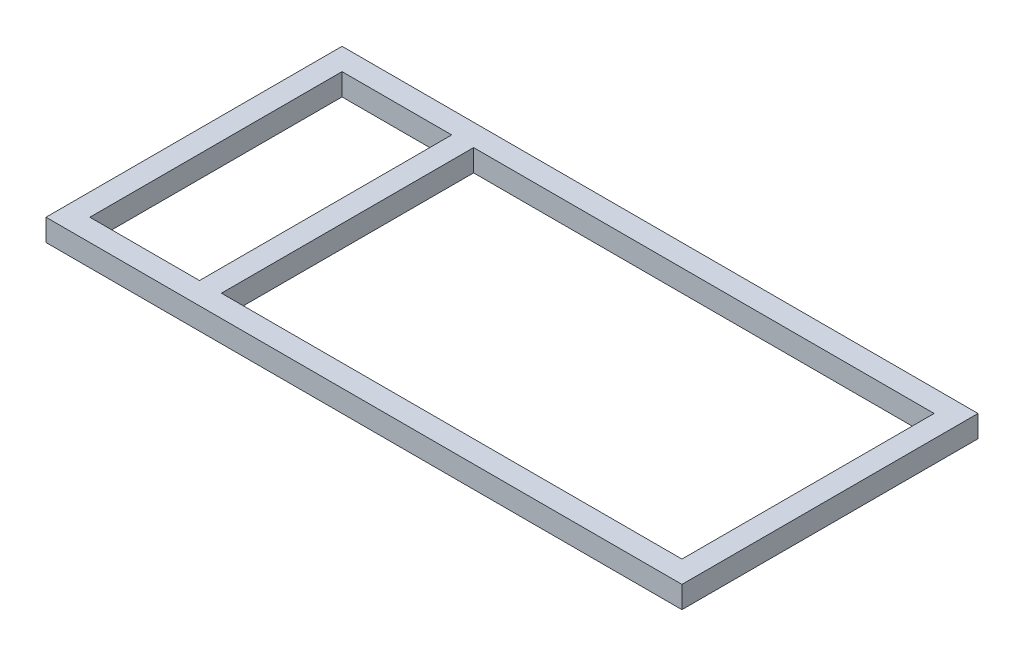
ISO-10303-21;
HEADER;
FILE_DESCRIPTION(('STEP AP214'),'2;1');
FILE_NAME('part.step','',(''),(''),'','','');
FILE_SCHEMA(('AUTOMOTIVE_DESIGN { 1 0 10303 214 1 1 1 1 }'));
ENDSEC;
DATA;
#1=APPLICATION_CONTEXT('core data for automotive mechanical design processes');
#2=APPLICATION_PROTOCOL_DEFINITION('international standard','automotive_design',2000,#1);
#3=PRODUCT_CONTEXT('',#1,'mechanical');
#4=PRODUCT('Part','Part','',(#3));
#5=PRODUCT_RELATED_PRODUCT_CATEGORY('part','',(#4));
#6=PRODUCT_DEFINITION_FORMATION('','',#4);
#7=PRODUCT_DEFINITION_CONTEXT('part definition',#1,'design');
#8=PRODUCT_DEFINITION('design','',#6,#7);
#9=PRODUCT_DEFINITION_SHAPE('','',#8);
#10=(LENGTH_UNIT() NAMED_UNIT(*) SI_UNIT(.MILLI.,.METRE.));
#11=(NAMED_UNIT(*) PLANE_ANGLE_UNIT() SI_UNIT($,.RADIAN.));
#12=(NAMED_UNIT(*) SI_UNIT($,.STERADIAN.) SOLID_ANGLE_UNIT());
#13=UNCERTAINTY_MEASURE_WITH_UNIT(LENGTH_MEASURE(1.E-05),#10,'distance_accuracy_value','');
#14=(GEOMETRIC_REPRESENTATION_CONTEXT(3) GLOBAL_UNCERTAINTY_ASSIGNED_CONTEXT((#13)) GLOBAL_UNIT_ASSIGNED_CONTEXT((#10,
#11,#12)) REPRESENTATION_CONTEXT('',''));
#15=CARTESIAN_POINT('',(0.,0.,0.));
#16=DIRECTION('',(0.,0.,1.));
#17=DIRECTION('',(1.,0.,0.));
#18=AXIS2_PLACEMENT_3D('',#15,#16,#17);
#19=CARTESIAN_POINT('',(0.,25.4,0.));
#20=DIRECTION('',(0.,-1.,0.));
#21=DIRECTION('',(0.,0.,-1.));
#22=AXIS2_PLACEMENT_3D('',#19,#20,#21);
#23=PLANE('',#22);
#24=DIRECTION('',(0.,0.,1.));
#25=VECTOR('',#24,1.);
#26=CARTESIAN_POINT('',(25.4,25.4,-25.4));
#27=LINE('',#26,#25);
#28=CARTESIAN_POINT('',(25.4,25.4,-317.5));
#29=VERTEX_POINT('',#28);
#30=CARTESIAN_POINT('',(25.4,25.4,-25.4));
#31=VERTEX_POINT('',#30);
#32=EDGE_CURVE('E158',#29,#31,#27,.T.);
#33=ORIENTED_EDGE('',*,*,#32,.F.);
#34=DIRECTION('',(-1.,0.,0.));
#35=VECTOR('',#34,1.);
#36=CARTESIAN_POINT('',(25.4,25.4,-317.5));
#37=LINE('',#36,#35);
#38=CARTESIAN_POINT('',(152.4,25.4,-317.5));
#39=VERTEX_POINT('',#38);
#40=EDGE_CURVE('E166',#39,#29,#37,.T.);
#41=ORIENTED_EDGE('',*,*,#40,.F.);
#42=DIRECTION('',(0.,0.,-1.));
#43=VECTOR('',#42,1.);
#44=CARTESIAN_POINT('',(152.4,25.4,-317.5));
#45=LINE('',#44,#43);
#46=CARTESIAN_POINT('',(152.4,25.4,-25.4));
#47=VERTEX_POINT('',#46);
#48=EDGE_CURVE('E163',#47,#39,#45,.T.);
#49=ORIENTED_EDGE('',*,*,#48,.F.);
#50=DIRECTION('',(1.,0.,0.));
#51=VECTOR('',#50,1.);
#52=CARTESIAN_POINT('',(25.4,25.4,-25.4));
#53=LINE('',#52,#51);
#54=EDGE_CURVE('E160',#31,#47,#53,.T.);
#55=ORIENTED_EDGE('',*,*,#54,.F.);
#56=EDGE_LOOP('',(#33,#41,#49,#55));
#57=FACE_BOUND('',#56,.T.);
#58=DIRECTION('',(0.,0.,1.));
#59=VECTOR('',#58,1.);
#60=CARTESIAN_POINT('',(0.,25.4,0.));
#61=LINE('',#60,#59);
#62=CARTESIAN_POINT('',(0.,25.4,-342.9));
#63=VERTEX_POINT('',#62);
#64=CARTESIAN_POINT('',(0.,25.4,0.));
#65=VERTEX_POINT('',#64);
#66=EDGE_CURVE('E189',#63,#65,#61,.T.);
#67=ORIENTED_EDGE('',*,*,#66,.T.);
#68=DIRECTION('',(1.,0.,0.));
#69=VECTOR('',#68,1.);
#70=CARTESIAN_POINT('',(0.,25.4,0.));
#71=LINE('',#70,#69);
#72=CARTESIAN_POINT('',(736.6,25.4,0.));
#73=VERTEX_POINT('',#72);
#74=EDGE_CURVE('E192',#65,#73,#71,.T.);
#75=ORIENTED_EDGE('',*,*,#74,.T.);
#76=DIRECTION('',(0.,0.,-1.));
#77=VECTOR('',#76,1.);
#78=CARTESIAN_POINT('',(736.6,25.4,0.));
#79=LINE('',#78,#77);
#80=CARTESIAN_POINT('',(736.6,25.4,-342.9));
#81=VERTEX_POINT('',#80);
#82=EDGE_CURVE('E195',#73,#81,#79,.T.);
#83=ORIENTED_EDGE('',*,*,#82,.T.);
#84=DIRECTION('',(-1.,0.,0.));
#85=VECTOR('',#84,1.);
#86=CARTESIAN_POINT('',(0.,25.4,-342.9));
#87=LINE('',#86,#85);
#88=EDGE_CURVE('E197',#81,#63,#87,.T.);
#89=ORIENTED_EDGE('',*,*,#88,.T.);
#90=EDGE_LOOP('',(#67,#75,#83,#89));
#91=FACE_BOUND('',#90,.T.);
#92=DIRECTION('',(-1.,0.,0.));
#93=VECTOR('',#92,1.);
#94=CARTESIAN_POINT('',(177.8,25.4,-317.5));
#95=LINE('',#94,#93);
#96=CARTESIAN_POINT('',(711.2,25.4,-317.5));
#97=VERTEX_POINT('',#96);
#98=CARTESIAN_POINT('',(177.8,25.4,-317.5));
#99=VERTEX_POINT('',#98);
#100=EDGE_CURVE('E122',#97,#99,#95,.T.);
#101=ORIENTED_EDGE('',*,*,#100,.F.);
#102=DIRECTION('',(0.,0.,-1.));
#103=VECTOR('',#102,1.);
#104=CARTESIAN_POINT('',(711.2,25.4,-25.4));
#105=LINE('',#104,#103);
#106=CARTESIAN_POINT('',(711.2,25.4,-25.4));
#107=VERTEX_POINT('',#106);
#108=EDGE_CURVE('E144',#107,#97,#105,.T.);
#109=ORIENTED_EDGE('',*,*,#108,.F.);
#110=DIRECTION('',(1.,0.,0.));
#111=VECTOR('',#110,1.);
#112=CARTESIAN_POINT('',(177.8,25.4,-25.4));
#113=LINE('',#112,#111);
#114=CARTESIAN_POINT('',(177.8,25.4,-25.4));
#115=VERTEX_POINT('',#114);
#116=EDGE_CURVE('E142',#115,#107,#113,.T.);
#117=ORIENTED_EDGE('',*,*,#116,.F.);
#118=DIRECTION('',(0.,0.,1.));
#119=VECTOR('',#118,1.);
#120=CARTESIAN_POINT('',(177.8,25.4,-25.4));
#121=LINE('',#120,#119);
#122=EDGE_CURVE('E130',#99,#115,#121,.T.);
#123=ORIENTED_EDGE('',*,*,#122,.F.);
#124=EDGE_LOOP('',(#101,#109,#117,#123));
#125=FACE_BOUND('',#124,.T.);
#126=ADVANCED_FACE('F33',(#57,#91,#125),#23,.F.);
#127=CARTESIAN_POINT('',(0.,0.,0.));
#128=DIRECTION('',(0.,-1.,0.));
#129=DIRECTION('',(0.,0.,-1.));
#130=AXIS2_PLACEMENT_3D('',#127,#128,#129);
#131=PLANE('',#130);
#132=DIRECTION('',(0.,0.,1.));
#133=VECTOR('',#132,1.);
#134=CARTESIAN_POINT('',(0.,0.,0.));
#135=LINE('',#134,#133);
#136=CARTESIAN_POINT('',(0.,0.,-342.9));
#137=VERTEX_POINT('',#136);
#138=CARTESIAN_POINT('',(0.,0.,0.));
#139=VERTEX_POINT('',#138);
#140=EDGE_CURVE('E188',#137,#139,#135,.T.);
#141=ORIENTED_EDGE('',*,*,#140,.F.);
#142=DIRECTION('',(-1.,0.,0.));
#143=VECTOR('',#142,1.);
#144=CARTESIAN_POINT('',(0.,0.,-342.9));
#145=LINE('',#144,#143);
#146=CARTESIAN_POINT('',(736.6,0.,-342.9));
#147=VERTEX_POINT('',#146);
#148=EDGE_CURVE('E193',#147,#137,#145,.T.);
#149=ORIENTED_EDGE('',*,*,#148,.F.);
#150=DIRECTION('',(0.,0.,-1.));
#151=VECTOR('',#150,1.);
#152=CARTESIAN_POINT('',(736.6,0.,0.));
#153=LINE('',#152,#151);
#154=CARTESIAN_POINT('',(736.6,0.,0.));
#155=VERTEX_POINT('',#154);
#156=EDGE_CURVE('E204',#155,#147,#153,.T.);
#157=ORIENTED_EDGE('',*,*,#156,.F.);
#158=DIRECTION('',(1.,0.,0.));
#159=VECTOR('',#158,1.);
#160=CARTESIAN_POINT('',(0.,0.,0.));
#161=LINE('',#160,#159);
#162=EDGE_CURVE('E202',#139,#155,#161,.T.);
#163=ORIENTED_EDGE('',*,*,#162,.F.);
#164=EDGE_LOOP('',(#141,#149,#157,#163));
#165=FACE_BOUND('',#164,.T.);
#166=DIRECTION('',(-1.,0.,0.));
#167=VECTOR('',#166,1.);
#168=CARTESIAN_POINT('',(25.4,0.,-317.5));
#169=LINE('',#168,#167);
#170=CARTESIAN_POINT('',(152.4,0.,-317.5));
#171=VERTEX_POINT('',#170);
#172=CARTESIAN_POINT('',(25.4,0.,-317.5));
#173=VERTEX_POINT('',#172);
#174=EDGE_CURVE('E161',#171,#173,#169,.T.);
#175=ORIENTED_EDGE('',*,*,#174,.T.);
#176=DIRECTION('',(0.,0.,1.));
#177=VECTOR('',#176,1.);
#178=CARTESIAN_POINT('',(25.4,0.,-25.4));
#179=LINE('',#178,#177);
#180=CARTESIAN_POINT('',(25.4,0.,-25.4));
#181=VERTEX_POINT('',#180);
#182=EDGE_CURVE('E138',#173,#181,#179,.T.);
#183=ORIENTED_EDGE('',*,*,#182,.T.);
#184=DIRECTION('',(1.,0.,0.));
#185=VECTOR('',#184,1.);
#186=CARTESIAN_POINT('',(25.4,0.,-25.4));
#187=LINE('',#186,#185);
#188=CARTESIAN_POINT('',(152.4,0.,-25.4));
#189=VERTEX_POINT('',#188);
#190=EDGE_CURVE('E171',#181,#189,#187,.T.);
#191=ORIENTED_EDGE('',*,*,#190,.T.);
#192=DIRECTION('',(0.,0.,-1.));
#193=VECTOR('',#192,1.);
#194=CARTESIAN_POINT('',(152.4,0.,-317.5));
#195=LINE('',#194,#193);
#196=EDGE_CURVE('E174',#189,#171,#195,.T.);
#197=ORIENTED_EDGE('',*,*,#196,.T.);
#198=EDGE_LOOP('',(#175,#183,#191,#197));
#199=FACE_BOUND('',#198,.T.);
#200=DIRECTION('',(0.,0.,-1.));
#201=VECTOR('',#200,1.);
#202=CARTESIAN_POINT('',(711.2,0.,-25.4));
#203=LINE('',#202,#201);
#204=CARTESIAN_POINT('',(711.2,0.,-25.4));
#205=VERTEX_POINT('',#204);
#206=CARTESIAN_POINT('',(711.2,0.,-317.5));
#207=VERTEX_POINT('',#206);
#208=EDGE_CURVE('E131',#205,#207,#203,.T.);
#209=ORIENTED_EDGE('',*,*,#208,.T.);
#210=DIRECTION('',(-1.,0.,0.));
#211=VECTOR('',#210,1.);
#212=CARTESIAN_POINT('',(177.8,0.,-317.5));
#213=LINE('',#212,#211);
#214=CARTESIAN_POINT('',(177.8,0.,-317.5));
#215=VERTEX_POINT('',#214);
#216=EDGE_CURVE('E56',#207,#215,#213,.T.);
#217=ORIENTED_EDGE('',*,*,#216,.T.);
#218=DIRECTION('',(0.,0.,1.));
#219=VECTOR('',#218,1.);
#220=CARTESIAN_POINT('',(177.8,0.,-25.4));
#221=LINE('',#220,#219);
#222=CARTESIAN_POINT('',(177.8,0.,-25.4));
#223=VERTEX_POINT('',#222);
#224=EDGE_CURVE('E137',#215,#223,#221,.T.);
#225=ORIENTED_EDGE('',*,*,#224,.T.);
#226=DIRECTION('',(1.,0.,0.));
#227=VECTOR('',#226,1.);
#228=CARTESIAN_POINT('',(177.8,0.,-25.4));
#229=LINE('',#228,#227);
#230=EDGE_CURVE('E150',#223,#205,#229,.T.);
#231=ORIENTED_EDGE('',*,*,#230,.T.);
#232=EDGE_LOOP('',(#209,#217,#225,#231));
#233=FACE_BOUND('',#232,.T.);
#234=ADVANCED_FACE('F222',(#165,#199,#233),#131,.T.);
#235=CARTESIAN_POINT('',(0.,25.4,0.));
#236=DIRECTION('',(1.,0.,0.));
#237=DIRECTION('',(0.,0.,-1.));
#238=AXIS2_PLACEMENT_3D('',#235,#236,#237);
#239=PLANE('',#238);
#240=ORIENTED_EDGE('',*,*,#140,.T.);
#241=DIRECTION('',(0.,-1.,0.));
#242=VECTOR('',#241,1.);
#243=CARTESIAN_POINT('',(0.,25.4,0.));
#244=LINE('',#243,#242);
#245=EDGE_CURVE('E11',#65,#139,#244,.T.);
#246=ORIENTED_EDGE('',*,*,#245,.F.);
#247=ORIENTED_EDGE('',*,*,#66,.F.);
#248=DIRECTION('',(0.,-1.,0.));
#249=VECTOR('',#248,1.);
#250=CARTESIAN_POINT('',(0.,25.4,-342.9));
#251=LINE('',#250,#249);
#252=EDGE_CURVE('E199',#63,#137,#251,.T.);
#253=ORIENTED_EDGE('',*,*,#252,.T.);
#254=EDGE_LOOP('',(#240,#246,#247,#253));
#255=FACE_BOUND('',#254,.T.);
#256=ADVANCED_FACE('F35',(#255),#239,.F.);
#257=CARTESIAN_POINT('',(0.,25.4,0.));
#258=DIRECTION('',(0.,0.,-1.));
#259=DIRECTION('',(-1.,0.,0.));
#260=AXIS2_PLACEMENT_3D('',#257,#258,#259);
#261=PLANE('',#260);
#262=ORIENTED_EDGE('',*,*,#162,.T.);
#263=DIRECTION('',(0.,-1.,0.));
#264=VECTOR('',#263,1.);
#265=CARTESIAN_POINT('',(736.6,25.4,0.));
#266=LINE('',#265,#264);
#267=EDGE_CURVE('E41',#73,#155,#266,.T.);
#268=ORIENTED_EDGE('',*,*,#267,.F.);
#269=ORIENTED_EDGE('',*,*,#74,.F.);
#270=ORIENTED_EDGE('',*,*,#245,.T.);
#271=EDGE_LOOP('',(#262,#268,#269,#270));
#272=FACE_BOUND('',#271,.T.);
#273=ADVANCED_FACE('F232',(#272),#261,.F.);
#274=CARTESIAN_POINT('',(736.6,25.4,0.));
#275=DIRECTION('',(-1.,0.,0.));
#276=DIRECTION('',(0.,0.,1.));
#277=AXIS2_PLACEMENT_3D('',#274,#275,#276);
#278=PLANE('',#277);
#279=ORIENTED_EDGE('',*,*,#156,.T.);
#280=DIRECTION('',(0.,-1.,0.));
#281=VECTOR('',#280,1.);
#282=CARTESIAN_POINT('',(736.6,25.4,-342.9));
#283=LINE('',#282,#281);
#284=EDGE_CURVE('E209',#81,#147,#283,.T.);
#285=ORIENTED_EDGE('',*,*,#284,.F.);
#286=ORIENTED_EDGE('',*,*,#82,.F.);
#287=ORIENTED_EDGE('',*,*,#267,.T.);
#288=EDGE_LOOP('',(#279,#285,#286,#287));
#289=FACE_BOUND('',#288,.T.);
#290=ADVANCED_FACE('F216',(#289),#278,.F.);
#291=CARTESIAN_POINT('',(0.,25.4,-342.9));
#292=DIRECTION('',(0.,0.,1.));
#293=DIRECTION('',(1.,0.,0.));
#294=AXIS2_PLACEMENT_3D('',#291,#292,#293);
#295=PLANE('',#294);
#296=ORIENTED_EDGE('',*,*,#148,.T.);
#297=ORIENTED_EDGE('',*,*,#252,.F.);
#298=ORIENTED_EDGE('',*,*,#88,.F.);
#299=ORIENTED_EDGE('',*,*,#284,.T.);
#300=EDGE_LOOP('',(#296,#297,#298,#299));
#301=FACE_BOUND('',#300,.T.);
#302=ADVANCED_FACE('F226',(#301),#295,.F.);
#303=CARTESIAN_POINT('',(25.4,25.4,-25.4));
#304=DIRECTION('',(1.,0.,0.));
#305=DIRECTION('',(0.,0.,-1.));
#306=AXIS2_PLACEMENT_3D('',#303,#304,#305);
#307=PLANE('',#306);
#308=ORIENTED_EDGE('',*,*,#182,.F.);
#309=DIRECTION('',(0.,-1.,0.));
#310=VECTOR('',#309,1.);
#311=CARTESIAN_POINT('',(25.4,25.4,-317.5));
#312=LINE('',#311,#310);
#313=EDGE_CURVE('E168',#29,#173,#312,.T.);
#314=ORIENTED_EDGE('',*,*,#313,.F.);
#315=ORIENTED_EDGE('',*,*,#32,.T.);
#316=DIRECTION('',(0.,-1.,0.));
#317=VECTOR('',#316,1.);
#318=CARTESIAN_POINT('',(25.4,25.4,-25.4));
#319=LINE('',#318,#317);
#320=EDGE_CURVE('E185',#31,#181,#319,.T.);
#321=ORIENTED_EDGE('',*,*,#320,.T.);
#322=EDGE_LOOP('',(#308,#314,#315,#321));
#323=FACE_BOUND('',#322,.T.);
#324=ADVANCED_FACE('F248',(#323),#307,.T.);
#325=CARTESIAN_POINT('',(25.4,25.4,-25.4));
#326=DIRECTION('',(0.,0.,-1.));
#327=DIRECTION('',(-1.,0.,0.));
#328=AXIS2_PLACEMENT_3D('',#325,#326,#327);
#329=PLANE('',#328);
#330=ORIENTED_EDGE('',*,*,#190,.F.);
#331=ORIENTED_EDGE('',*,*,#320,.F.);
#332=ORIENTED_EDGE('',*,*,#54,.T.);
#333=DIRECTION('',(0.,-1.,0.));
#334=VECTOR('',#333,1.);
#335=CARTESIAN_POINT('',(152.4,25.4,-25.4));
#336=LINE('',#335,#334);
#337=EDGE_CURVE('E183',#47,#189,#336,.T.);
#338=ORIENTED_EDGE('',*,*,#337,.T.);
#339=EDGE_LOOP('',(#330,#331,#332,#338));
#340=FACE_BOUND('',#339,.T.);
#341=ADVANCED_FACE('F255',(#340),#329,.T.);
#342=CARTESIAN_POINT('',(152.4,25.4,-317.5));
#343=DIRECTION('',(-1.,0.,0.));
#344=DIRECTION('',(0.,0.,1.));
#345=AXIS2_PLACEMENT_3D('',#342,#343,#344);
#346=PLANE('',#345);
#347=ORIENTED_EDGE('',*,*,#196,.F.);
#348=ORIENTED_EDGE('',*,*,#337,.F.);
#349=ORIENTED_EDGE('',*,*,#48,.T.);
#350=DIRECTION('',(0.,-1.,0.));
#351=VECTOR('',#350,1.);
#352=CARTESIAN_POINT('',(152.4,25.4,-317.5));
#353=LINE('',#352,#351);
#354=EDGE_CURVE('E181',#39,#171,#353,.T.);
#355=ORIENTED_EDGE('',*,*,#354,.T.);
#356=EDGE_LOOP('',(#347,#348,#349,#355));
#357=FACE_BOUND('',#356,.T.);
#358=ADVANCED_FACE('F260',(#357),#346,.T.);
#359=CARTESIAN_POINT('',(25.4,25.4,-317.5));
#360=DIRECTION('',(0.,0.,1.));
#361=DIRECTION('',(1.,0.,0.));
#362=AXIS2_PLACEMENT_3D('',#359,#360,#361);
#363=PLANE('',#362);
#364=ORIENTED_EDGE('',*,*,#174,.F.);
#365=ORIENTED_EDGE('',*,*,#354,.F.);
#366=ORIENTED_EDGE('',*,*,#40,.T.);
#367=ORIENTED_EDGE('',*,*,#313,.T.);
#368=EDGE_LOOP('',(#364,#365,#366,#367));
#369=FACE_BOUND('',#368,.T.);
#370=ADVANCED_FACE('F266',(#369),#363,.T.);
#371=CARTESIAN_POINT('',(177.8,25.4,-317.5));
#372=DIRECTION('',(0.,0.,1.));
#373=DIRECTION('',(1.,0.,0.));
#374=AXIS2_PLACEMENT_3D('',#371,#372,#373);
#375=PLANE('',#374);
#376=ORIENTED_EDGE('',*,*,#216,.F.);
#377=DIRECTION('',(0.,-1.,0.));
#378=VECTOR('',#377,1.);
#379=CARTESIAN_POINT('',(711.2,25.4,-317.5));
#380=LINE('',#379,#378);
#381=EDGE_CURVE('E126',#97,#207,#380,.T.);
#382=ORIENTED_EDGE('',*,*,#381,.F.);
#383=ORIENTED_EDGE('',*,*,#100,.T.);
#384=DIRECTION('',(0.,-1.,0.));
#385=VECTOR('',#384,1.);
#386=CARTESIAN_POINT('',(177.8,25.4,-317.5));
#387=LINE('',#386,#385);
#388=EDGE_CURVE('E125',#99,#215,#387,.T.);
#389=ORIENTED_EDGE('',*,*,#388,.T.);
#390=EDGE_LOOP('',(#376,#382,#383,#389));
#391=FACE_BOUND('',#390,.T.);
#392=ADVANCED_FACE('F124',(#391),#375,.T.);
#393=CARTESIAN_POINT('',(177.8,25.4,-25.4));
#394=DIRECTION('',(1.,0.,0.));
#395=DIRECTION('',(0.,0.,-1.));
#396=AXIS2_PLACEMENT_3D('',#393,#394,#395);
#397=PLANE('',#396);
#398=ORIENTED_EDGE('',*,*,#224,.F.);
#399=ORIENTED_EDGE('',*,*,#388,.F.);
#400=ORIENTED_EDGE('',*,*,#122,.T.);
#401=DIRECTION('',(0.,-1.,0.));
#402=VECTOR('',#401,1.);
#403=CARTESIAN_POINT('',(177.8,25.4,-25.4));
#404=LINE('',#403,#402);
#405=EDGE_CURVE('E139',#115,#223,#404,.T.);
#406=ORIENTED_EDGE('',*,*,#405,.T.);
#407=EDGE_LOOP('',(#398,#399,#400,#406));
#408=FACE_BOUND('',#407,.T.);
#409=ADVANCED_FACE('F134',(#408),#397,.T.);
#410=CARTESIAN_POINT('',(177.8,25.4,-25.4));
#411=DIRECTION('',(0.,0.,-1.));
#412=DIRECTION('',(-1.,0.,0.));
#413=AXIS2_PLACEMENT_3D('',#410,#411,#412);
#414=PLANE('',#413);
#415=ORIENTED_EDGE('',*,*,#230,.F.);
#416=ORIENTED_EDGE('',*,*,#405,.F.);
#417=ORIENTED_EDGE('',*,*,#116,.T.);
#418=DIRECTION('',(0.,-1.,0.));
#419=VECTOR('',#418,1.);
#420=CARTESIAN_POINT('',(711.2,25.4,-25.4));
#421=LINE('',#420,#419);
#422=EDGE_CURVE('E48',#107,#205,#421,.T.);
#423=ORIENTED_EDGE('',*,*,#422,.T.);
#424=EDGE_LOOP('',(#415,#416,#417,#423));
#425=FACE_BOUND('',#424,.T.);
#426=ADVANCED_FACE('F285',(#425),#414,.T.);
#427=CARTESIAN_POINT('',(711.2,25.4,-25.4));
#428=DIRECTION('',(-1.,0.,0.));
#429=DIRECTION('',(0.,0.,1.));
#430=AXIS2_PLACEMENT_3D('',#427,#428,#429);
#431=PLANE('',#430);
#432=ORIENTED_EDGE('',*,*,#208,.F.);
#433=ORIENTED_EDGE('',*,*,#422,.F.);
#434=ORIENTED_EDGE('',*,*,#108,.T.);
#435=ORIENTED_EDGE('',*,*,#381,.T.);
#436=EDGE_LOOP('',(#432,#433,#434,#435));
#437=FACE_BOUND('',#436,.T.);
#438=ADVANCED_FACE('F288',(#437),#431,.T.);
#439=CLOSED_SHELL('',(#126,#234,#256,#273,#290,#302,#324,#341,#358,#370,#392,#409,#426,#438));
#440=MANIFOLD_SOLID_BREP('B2',#439);
#441=ADVANCED_BREP_SHAPE_REPRESENTATION('',(#18,#440),#14);
#442=SHAPE_DEFINITION_REPRESENTATION(#9,#441);
ENDSEC;
END-ISO-10303-21;
